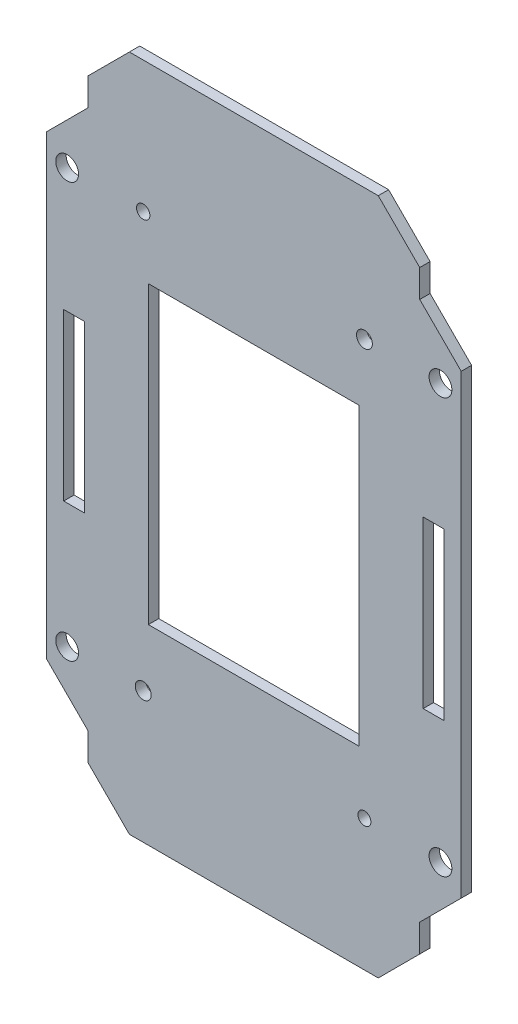
ISO-10303-21;
HEADER;
FILE_DESCRIPTION(('STEP AP214'),'2;1');
FILE_NAME('part.step','',(''),(''),'','','');
FILE_SCHEMA(('AUTOMOTIVE_DESIGN { 1 0 10303 214 1 1 1 1 }'));
ENDSEC;
DATA;
#1=APPLICATION_CONTEXT('core data for automotive mechanical design processes');
#2=APPLICATION_PROTOCOL_DEFINITION('international standard','automotive_design',2000,#1);
#3=PRODUCT_CONTEXT('',#1,'mechanical');
#4=PRODUCT('Part','Part','',(#3));
#5=PRODUCT_RELATED_PRODUCT_CATEGORY('part','',(#4));
#6=PRODUCT_DEFINITION_FORMATION('','',#4);
#7=PRODUCT_DEFINITION_CONTEXT('part definition',#1,'design');
#8=PRODUCT_DEFINITION('design','',#6,#7);
#9=PRODUCT_DEFINITION_SHAPE('','',#8);
#10=(LENGTH_UNIT() NAMED_UNIT(*) SI_UNIT(.MILLI.,.METRE.));
#11=(NAMED_UNIT(*) PLANE_ANGLE_UNIT() SI_UNIT($,.RADIAN.));
#12=(NAMED_UNIT(*) SI_UNIT($,.STERADIAN.) SOLID_ANGLE_UNIT());
#13=UNCERTAINTY_MEASURE_WITH_UNIT(LENGTH_MEASURE(1.E-05),#10,'distance_accuracy_value','');
#14=(GEOMETRIC_REPRESENTATION_CONTEXT(3) GLOBAL_UNCERTAINTY_ASSIGNED_CONTEXT((#13)) GLOBAL_UNIT_ASSIGNED_CONTEXT((#10,
#11,#12)) REPRESENTATION_CONTEXT('',''));
#15=CARTESIAN_POINT('',(0.,0.,0.));
#16=DIRECTION('',(0.,0.,1.));
#17=DIRECTION('',(1.,0.,0.));
#18=AXIS2_PLACEMENT_3D('',#15,#16,#17);
#19=CARTESIAN_POINT('',(0.,0.,1.5));
#20=DIRECTION('',(0.,0.,-1.));
#21=DIRECTION('',(-1.,0.,0.));
#22=AXIS2_PLACEMENT_3D('',#19,#20,#21);
#23=PLANE('',#22);
#24=DIRECTION('',(0.,-1.,0.));
#25=VECTOR('',#24,1.);
#26=CARTESIAN_POINT('',(-27.5,12.,1.5));
#27=LINE('',#26,#25);
#28=CARTESIAN_POINT('',(-27.5,12.,1.5));
#29=VERTEX_POINT('',#28);
#30=CARTESIAN_POINT('',(-27.5,-12.,1.5));
#31=VERTEX_POINT('',#30);
#32=EDGE_CURVE('E260',#29,#31,#27,.T.);
#33=ORIENTED_EDGE('',*,*,#32,.F.);
#34=DIRECTION('',(-1.,0.,0.));
#35=VECTOR('',#34,1.);
#36=CARTESIAN_POINT('',(-24.5,12.,1.5));
#37=LINE('',#36,#35);
#38=CARTESIAN_POINT('',(-24.5,12.,1.5));
#39=VERTEX_POINT('',#38);
#40=EDGE_CURVE('E268',#39,#29,#37,.T.);
#41=ORIENTED_EDGE('',*,*,#40,.F.);
#42=DIRECTION('',(0.,1.,0.));
#43=VECTOR('',#42,1.);
#44=CARTESIAN_POINT('',(-24.5,-12.,1.5));
#45=LINE('',#44,#43);
#46=CARTESIAN_POINT('',(-24.5,-12.,1.5));
#47=VERTEX_POINT('',#46);
#48=EDGE_CURVE('E265',#47,#39,#45,.T.);
#49=ORIENTED_EDGE('',*,*,#48,.F.);
#50=DIRECTION('',(1.,0.,0.));
#51=VECTOR('',#50,1.);
#52=CARTESIAN_POINT('',(-27.5,-12.,1.5));
#53=LINE('',#52,#51);
#54=EDGE_CURVE('E262',#31,#47,#53,.T.);
#55=ORIENTED_EDGE('',*,*,#54,.F.);
#56=EDGE_LOOP('',(#33,#41,#49,#55));
#57=FACE_BOUND('',#56,.T.);
#58=CARTESIAN_POINT('',(-16.,30.,1.5));
#59=DIRECTION('',(0.,0.,1.));
#60=DIRECTION('',(1.,0.,0.));
#61=AXIS2_PLACEMENT_3D('',#58,#59,#60);
#62=CIRCLE('',#61,0.967686677567539);
#63=CARTESIAN_POINT('',(-15.0323133224325,30.,1.5));
#64=VERTEX_POINT('',#63);
#65=EDGE_CURVE('E346',#64,#64,#62,.T.);
#66=ORIENTED_EDGE('',*,*,#65,.F.);
#67=EDGE_LOOP('',(#66));
#68=FACE_BOUND('',#67,.T.);
#69=CARTESIAN_POINT('',(16.,30.,1.5));
#70=DIRECTION('',(0.,0.,1.));
#71=DIRECTION('',(1.,0.,0.));
#72=AXIS2_PLACEMENT_3D('',#69,#70,#71);
#73=CIRCLE('',#72,1.15);
#74=CARTESIAN_POINT('',(17.15,30.,1.5));
#75=VERTEX_POINT('',#74);
#76=EDGE_CURVE('E352',#75,#75,#73,.T.);
#77=ORIENTED_EDGE('',*,*,#76,.F.);
#78=EDGE_LOOP('',(#77));
#79=FACE_BOUND('',#78,.T.);
#80=CARTESIAN_POINT('',(-16.,-30.,1.5));
#81=DIRECTION('',(0.,0.,1.));
#82=DIRECTION('',(1.,0.,0.));
#83=AXIS2_PLACEMENT_3D('',#80,#81,#82);
#84=CIRCLE('',#83,1.15);
#85=CARTESIAN_POINT('',(-14.85,-30.,1.5));
#86=VERTEX_POINT('',#85);
#87=EDGE_CURVE('E358',#86,#86,#84,.T.);
#88=ORIENTED_EDGE('',*,*,#87,.F.);
#89=EDGE_LOOP('',(#88));
#90=FACE_BOUND('',#89,.T.);
#91=CARTESIAN_POINT('',(16.,-30.,1.5));
#92=DIRECTION('',(0.,0.,1.));
#93=DIRECTION('',(1.,0.,0.));
#94=AXIS2_PLACEMENT_3D('',#91,#92,#93);
#95=CIRCLE('',#94,0.939967297360413);
#96=CARTESIAN_POINT('',(16.9399672973604,-30.,1.5));
#97=VERTEX_POINT('',#96);
#98=EDGE_CURVE('E364',#97,#97,#95,.T.);
#99=ORIENTED_EDGE('',*,*,#98,.F.);
#100=EDGE_LOOP('',(#99));
#101=FACE_BOUND('',#100,.T.);
#102=DIRECTION('',(0.707106781186548,0.707106781186548,0.));
#103=VECTOR('',#102,1.);
#104=CARTESIAN_POINT('',(30.,-33.,1.5));
#105=LINE('',#104,#103);
#106=CARTESIAN_POINT('',(24.,-39.,1.5));
#107=VERTEX_POINT('',#106);
#108=CARTESIAN_POINT('',(30.,-33.,1.5));
#109=VERTEX_POINT('',#108);
#110=EDGE_CURVE('E370',#107,#109,#105,.T.);
#111=ORIENTED_EDGE('',*,*,#110,.T.);
#112=DIRECTION('',(0.,1.,0.));
#113=VECTOR('',#112,1.);
#114=CARTESIAN_POINT('',(30.,33.,1.5));
#115=LINE('',#114,#113);
#116=CARTESIAN_POINT('',(30.,33.,1.5));
#117=VERTEX_POINT('',#116);
#118=EDGE_CURVE('E373',#109,#117,#115,.T.);
#119=ORIENTED_EDGE('',*,*,#118,.T.);
#120=DIRECTION('',(-0.707106781186548,0.707106781186548,0.));
#121=VECTOR('',#120,1.);
#122=CARTESIAN_POINT('',(24.,39.,1.5));
#123=LINE('',#122,#121);
#124=CARTESIAN_POINT('',(24.,39.,1.5));
#125=VERTEX_POINT('',#124);
#126=EDGE_CURVE('E376',#117,#125,#123,.T.);
#127=ORIENTED_EDGE('',*,*,#126,.T.);
#128=DIRECTION('',(0.,1.,0.));
#129=VECTOR('',#128,1.);
#130=CARTESIAN_POINT('',(24.,43.,1.5));
#131=LINE('',#130,#129);
#132=CARTESIAN_POINT('',(24.,43.,1.5));
#133=VERTEX_POINT('',#132);
#134=EDGE_CURVE('E378',#125,#133,#131,.T.);
#135=ORIENTED_EDGE('',*,*,#134,.T.);
#136=DIRECTION('',(-0.707106781186547,0.707106781186548,0.));
#137=VECTOR('',#136,1.);
#138=CARTESIAN_POINT('',(18.,49.,1.5));
#139=LINE('',#138,#137);
#140=CARTESIAN_POINT('',(18.,49.,1.5));
#141=VERTEX_POINT('',#140);
#142=EDGE_CURVE('E380',#133,#141,#139,.T.);
#143=ORIENTED_EDGE('',*,*,#142,.T.);
#144=DIRECTION('',(-1.,0.,0.));
#145=VECTOR('',#144,1.);
#146=CARTESIAN_POINT('',(-18.,49.,1.5));
#147=LINE('',#146,#145);
#148=CARTESIAN_POINT('',(-18.,49.,1.5));
#149=VERTEX_POINT('',#148);
#150=EDGE_CURVE('E382',#141,#149,#147,.T.);
#151=ORIENTED_EDGE('',*,*,#150,.T.);
#152=DIRECTION('',(-0.707106781186547,-0.707106781186548,0.));
#153=VECTOR('',#152,1.);
#154=CARTESIAN_POINT('',(-24.,43.,1.5));
#155=LINE('',#154,#153);
#156=CARTESIAN_POINT('',(-24.,43.,1.5));
#157=VERTEX_POINT('',#156);
#158=EDGE_CURVE('E384',#149,#157,#155,.T.);
#159=ORIENTED_EDGE('',*,*,#158,.T.);
#160=DIRECTION('',(0.,-1.,0.));
#161=VECTOR('',#160,1.);
#162=CARTESIAN_POINT('',(-24.,39.,1.5));
#163=LINE('',#162,#161);
#164=CARTESIAN_POINT('',(-24.,39.,1.5));
#165=VERTEX_POINT('',#164);
#166=EDGE_CURVE('E386',#157,#165,#163,.T.);
#167=ORIENTED_EDGE('',*,*,#166,.T.);
#168=DIRECTION('',(-0.707106781186548,-0.707106781186548,0.));
#169=VECTOR('',#168,1.);
#170=CARTESIAN_POINT('',(-30.,33.,1.5));
#171=LINE('',#170,#169);
#172=CARTESIAN_POINT('',(-30.,33.,1.5));
#173=VERTEX_POINT('',#172);
#174=EDGE_CURVE('E388',#165,#173,#171,.T.);
#175=ORIENTED_EDGE('',*,*,#174,.T.);
#176=DIRECTION('',(0.,-1.,0.));
#177=VECTOR('',#176,1.);
#178=CARTESIAN_POINT('',(-30.,-33.,1.5));
#179=LINE('',#178,#177);
#180=CARTESIAN_POINT('',(-30.,-33.,1.5));
#181=VERTEX_POINT('',#180);
#182=EDGE_CURVE('E390',#173,#181,#179,.T.);
#183=ORIENTED_EDGE('',*,*,#182,.T.);
#184=DIRECTION('',(0.707106781186548,-0.707106781186548,0.));
#185=VECTOR('',#184,1.);
#186=CARTESIAN_POINT('',(-24.,-39.,1.5));
#187=LINE('',#186,#185);
#188=CARTESIAN_POINT('',(-24.,-39.,1.5));
#189=VERTEX_POINT('',#188);
#190=EDGE_CURVE('E392',#181,#189,#187,.T.);
#191=ORIENTED_EDGE('',*,*,#190,.T.);
#192=DIRECTION('',(0.,-1.,0.));
#193=VECTOR('',#192,1.);
#194=CARTESIAN_POINT('',(-24.,-43.,1.5));
#195=LINE('',#194,#193);
#196=CARTESIAN_POINT('',(-24.,-43.,1.5));
#197=VERTEX_POINT('',#196);
#198=EDGE_CURVE('E394',#189,#197,#195,.T.);
#199=ORIENTED_EDGE('',*,*,#198,.T.);
#200=DIRECTION('',(0.707106781186547,-0.707106781186548,0.));
#201=VECTOR('',#200,1.);
#202=CARTESIAN_POINT('',(-18.,-49.,1.5));
#203=LINE('',#202,#201);
#204=CARTESIAN_POINT('',(-18.,-49.,1.5));
#205=VERTEX_POINT('',#204);
#206=EDGE_CURVE('E396',#197,#205,#203,.T.);
#207=ORIENTED_EDGE('',*,*,#206,.T.);
#208=DIRECTION('',(1.,0.,0.));
#209=VECTOR('',#208,1.);
#210=CARTESIAN_POINT('',(18.,-49.,1.5));
#211=LINE('',#210,#209);
#212=CARTESIAN_POINT('',(18.,-49.,1.5));
#213=VERTEX_POINT('',#212);
#214=EDGE_CURVE('E398',#205,#213,#211,.T.);
#215=ORIENTED_EDGE('',*,*,#214,.T.);
#216=DIRECTION('',(0.707106781186547,0.707106781186548,0.));
#217=VECTOR('',#216,1.);
#218=CARTESIAN_POINT('',(24.,-43.,1.5));
#219=LINE('',#218,#217);
#220=CARTESIAN_POINT('',(24.,-43.,1.5));
#221=VERTEX_POINT('',#220);
#222=EDGE_CURVE('E400',#213,#221,#219,.T.);
#223=ORIENTED_EDGE('',*,*,#222,.T.);
#224=DIRECTION('',(0.,1.,0.));
#225=VECTOR('',#224,1.);
#226=CARTESIAN_POINT('',(24.,-39.,1.5));
#227=LINE('',#226,#225);
#228=EDGE_CURVE('E402',#221,#107,#227,.T.);
#229=ORIENTED_EDGE('',*,*,#228,.T.);
#230=EDGE_LOOP('',(#111,#119,#127,#135,#143,#151,#159,#167,#175,#183,#191,#199,#207,#215,#223,#229));
#231=FACE_BOUND('',#230,.T.);
#232=DIRECTION('',(0.,1.,0.));
#233=VECTOR('',#232,1.);
#234=CARTESIAN_POINT('',(15.2491,21.3549,1.5));
#235=LINE('',#234,#233);
#236=CARTESIAN_POINT('',(15.2491,-21.3549,1.5));
#237=VERTEX_POINT('',#236);
#238=CARTESIAN_POINT('',(15.2491,21.3549,1.5));
#239=VERTEX_POINT('',#238);
#240=EDGE_CURVE('E315',#237,#239,#235,.T.);
#241=ORIENTED_EDGE('',*,*,#240,.F.);
#242=DIRECTION('',(1.,0.,0.));
#243=VECTOR('',#242,1.);
#244=CARTESIAN_POINT('',(-15.2491,-21.3549,1.5));
#245=LINE('',#244,#243);
#246=CARTESIAN_POINT('',(-15.2491,-21.3549,1.5));
#247=VERTEX_POINT('',#246);
#248=EDGE_CURVE('E323',#247,#237,#245,.T.);
#249=ORIENTED_EDGE('',*,*,#248,.F.);
#250=DIRECTION('',(0.,-1.,0.));
#251=VECTOR('',#250,1.);
#252=CARTESIAN_POINT('',(-15.2491,21.3549,1.5));
#253=LINE('',#252,#251);
#254=CARTESIAN_POINT('',(-15.2491,21.3549,1.5));
#255=VERTEX_POINT('',#254);
#256=EDGE_CURVE('E320',#255,#247,#253,.T.);
#257=ORIENTED_EDGE('',*,*,#256,.F.);
#258=DIRECTION('',(-1.,0.,0.));
#259=VECTOR('',#258,1.);
#260=CARTESIAN_POINT('',(-15.2491,21.3549,1.5));
#261=LINE('',#260,#259);
#262=EDGE_CURVE('E317',#239,#255,#261,.T.);
#263=ORIENTED_EDGE('',*,*,#262,.F.);
#264=EDGE_LOOP('',(#241,#249,#257,#263));
#265=FACE_BOUND('',#264,.T.);
#266=CARTESIAN_POINT('',(-27.,-30.,1.5));
#267=DIRECTION('',(0.,0.,1.));
#268=DIRECTION('',(1.,0.,0.));
#269=AXIS2_PLACEMENT_3D('',#266,#267,#268);
#270=CIRCLE('',#269,1.65);
#271=CARTESIAN_POINT('',(-25.35,-30.,1.5));
#272=VERTEX_POINT('',#271);
#273=EDGE_CURVE('E309',#272,#272,#270,.T.);
#274=ORIENTED_EDGE('',*,*,#273,.F.);
#275=EDGE_LOOP('',(#274));
#276=FACE_BOUND('',#275,.T.);
#277=CARTESIAN_POINT('',(-27.,30.,1.5));
#278=DIRECTION('',(0.,0.,1.));
#279=DIRECTION('',(1.,0.,0.));
#280=AXIS2_PLACEMENT_3D('',#277,#278,#279);
#281=CIRCLE('',#280,1.65);
#282=CARTESIAN_POINT('',(-25.35,30.,1.5));
#283=VERTEX_POINT('',#282);
#284=EDGE_CURVE('E303',#283,#283,#281,.T.);
#285=ORIENTED_EDGE('',*,*,#284,.F.);
#286=EDGE_LOOP('',(#285));
#287=FACE_BOUND('',#286,.T.);
#288=CARTESIAN_POINT('',(27.,-30.,1.5));
#289=DIRECTION('',(0.,0.,1.));
#290=DIRECTION('',(1.,0.,0.));
#291=AXIS2_PLACEMENT_3D('',#288,#289,#290);
#292=CIRCLE('',#291,1.65);
#293=CARTESIAN_POINT('',(28.65,-30.,1.5));
#294=VERTEX_POINT('',#293);
#295=EDGE_CURVE('E297',#294,#294,#292,.T.);
#296=ORIENTED_EDGE('',*,*,#295,.F.);
#297=EDGE_LOOP('',(#296));
#298=FACE_BOUND('',#297,.T.);
#299=CARTESIAN_POINT('',(27.,30.,1.5));
#300=DIRECTION('',(0.,0.,1.));
#301=DIRECTION('',(1.,0.,0.));
#302=AXIS2_PLACEMENT_3D('',#299,#300,#301);
#303=CIRCLE('',#302,1.65);
#304=CARTESIAN_POINT('',(28.65,30.,1.5));
#305=VERTEX_POINT('',#304);
#306=EDGE_CURVE('E291',#305,#305,#303,.T.);
#307=ORIENTED_EDGE('',*,*,#306,.F.);
#308=EDGE_LOOP('',(#307));
#309=FACE_BOUND('',#308,.T.);
#310=DIRECTION('',(0.,-1.,0.));
#311=VECTOR('',#310,1.);
#312=CARTESIAN_POINT('',(24.5,12.,1.5));
#313=LINE('',#312,#311);
#314=CARTESIAN_POINT('',(24.5,12.,1.5));
#315=VERTEX_POINT('',#314);
#316=CARTESIAN_POINT('',(24.5,-12.,1.5));
#317=VERTEX_POINT('',#316);
#318=EDGE_CURVE('E224',#315,#317,#313,.T.);
#319=ORIENTED_EDGE('',*,*,#318,.F.);
#320=DIRECTION('',(-1.,0.,0.));
#321=VECTOR('',#320,1.);
#322=CARTESIAN_POINT('',(27.5,12.,1.5));
#323=LINE('',#322,#321);
#324=CARTESIAN_POINT('',(27.5,12.,1.5));
#325=VERTEX_POINT('',#324);
#326=EDGE_CURVE('E246',#325,#315,#323,.T.);
#327=ORIENTED_EDGE('',*,*,#326,.F.);
#328=DIRECTION('',(0.,1.,0.));
#329=VECTOR('',#328,1.);
#330=CARTESIAN_POINT('',(27.5,-12.,1.5));
#331=LINE('',#330,#329);
#332=CARTESIAN_POINT('',(27.5,-12.,1.5));
#333=VERTEX_POINT('',#332);
#334=EDGE_CURVE('E244',#333,#325,#331,.T.);
#335=ORIENTED_EDGE('',*,*,#334,.F.);
#336=DIRECTION('',(1.,0.,0.));
#337=VECTOR('',#336,1.);
#338=CARTESIAN_POINT('',(24.5,-12.,1.5));
#339=LINE('',#338,#337);
#340=EDGE_CURVE('E232',#317,#333,#339,.T.);
#341=ORIENTED_EDGE('',*,*,#340,.F.);
#342=EDGE_LOOP('',(#319,#327,#335,#341));
#343=FACE_BOUND('',#342,.T.);
#344=ADVANCED_FACE('F39',(#57,#68,#79,#90,#101,#231,#265,#276,#287,#298,#309,#343),#23,.F.);
#345=CARTESIAN_POINT('',(0.,0.,0.));
#346=DIRECTION('',(0.,0.,-1.));
#347=DIRECTION('',(-1.,0.,0.));
#348=AXIS2_PLACEMENT_3D('',#345,#346,#347);
#349=PLANE('',#348);
#350=CARTESIAN_POINT('',(27.,-30.,0.));
#351=DIRECTION('',(0.,0.,1.));
#352=DIRECTION('',(1.,0.,0.));
#353=AXIS2_PLACEMENT_3D('',#350,#351,#352);
#354=CIRCLE('',#353,1.65);
#355=CARTESIAN_POINT('',(28.65,-30.,0.));
#356=VERTEX_POINT('',#355);
#357=EDGE_CURVE('E294',#356,#356,#354,.T.);
#358=ORIENTED_EDGE('',*,*,#357,.T.);
#359=EDGE_LOOP('',(#358));
#360=FACE_BOUND('',#359,.T.);
#361=CARTESIAN_POINT('',(-27.,-30.,0.));
#362=DIRECTION('',(0.,0.,1.));
#363=DIRECTION('',(1.,0.,0.));
#364=AXIS2_PLACEMENT_3D('',#361,#362,#363);
#365=CIRCLE('',#364,1.65);
#366=CARTESIAN_POINT('',(-25.35,-30.,0.));
#367=VERTEX_POINT('',#366);
#368=EDGE_CURVE('E306',#367,#367,#365,.T.);
#369=ORIENTED_EDGE('',*,*,#368,.T.);
#370=EDGE_LOOP('',(#369));
#371=FACE_BOUND('',#370,.T.);
#372=CARTESIAN_POINT('',(16.,30.,0.));
#373=DIRECTION('',(0.,0.,1.));
#374=DIRECTION('',(1.,0.,0.));
#375=AXIS2_PLACEMENT_3D('',#372,#373,#374);
#376=CIRCLE('',#375,1.15);
#377=CARTESIAN_POINT('',(17.15,30.,0.));
#378=VERTEX_POINT('',#377);
#379=EDGE_CURVE('E349',#378,#378,#376,.T.);
#380=ORIENTED_EDGE('',*,*,#379,.T.);
#381=EDGE_LOOP('',(#380));
#382=FACE_BOUND('',#381,.T.);
#383=CARTESIAN_POINT('',(16.,-30.,0.));
#384=DIRECTION('',(0.,0.,1.));
#385=DIRECTION('',(1.,0.,0.));
#386=AXIS2_PLACEMENT_3D('',#383,#384,#385);
#387=CIRCLE('',#386,0.939967297360413);
#388=CARTESIAN_POINT('',(16.9399672973604,-30.,0.));
#389=VERTEX_POINT('',#388);
#390=EDGE_CURVE('E361',#389,#389,#387,.T.);
#391=ORIENTED_EDGE('',*,*,#390,.T.);
#392=EDGE_LOOP('',(#391));
#393=FACE_BOUND('',#392,.T.);
#394=DIRECTION('',(0.707106781186548,0.707106781186548,0.));
#395=VECTOR('',#394,1.);
#396=CARTESIAN_POINT('',(30.,-33.,0.));
#397=LINE('',#396,#395);
#398=CARTESIAN_POINT('',(24.,-39.,0.));
#399=VERTEX_POINT('',#398);
#400=CARTESIAN_POINT('',(30.,-33.,0.));
#401=VERTEX_POINT('',#400);
#402=EDGE_CURVE('E367',#399,#401,#397,.T.);
#403=ORIENTED_EDGE('',*,*,#402,.F.);
#404=DIRECTION('',(0.,1.,0.));
#405=VECTOR('',#404,1.);
#406=CARTESIAN_POINT('',(24.,-39.,0.));
#407=LINE('',#406,#405);
#408=CARTESIAN_POINT('',(24.,-43.,0.));
#409=VERTEX_POINT('',#408);
#410=EDGE_CURVE('E374',#409,#399,#407,.T.);
#411=ORIENTED_EDGE('',*,*,#410,.F.);
#412=DIRECTION('',(0.707106781186547,0.707106781186548,0.));
#413=VECTOR('',#412,1.);
#414=CARTESIAN_POINT('',(24.,-43.,0.));
#415=LINE('',#414,#413);
#416=CARTESIAN_POINT('',(18.,-49.,0.));
#417=VERTEX_POINT('',#416);
#418=EDGE_CURVE('E433',#417,#409,#415,.T.);
#419=ORIENTED_EDGE('',*,*,#418,.F.);
#420=DIRECTION('',(1.,0.,0.));
#421=VECTOR('',#420,1.);
#422=CARTESIAN_POINT('',(18.,-49.,0.));
#423=LINE('',#422,#421);
#424=CARTESIAN_POINT('',(-18.,-49.,0.));
#425=VERTEX_POINT('',#424);
#426=EDGE_CURVE('E431',#425,#417,#423,.T.);
#427=ORIENTED_EDGE('',*,*,#426,.F.);
#428=DIRECTION('',(0.707106781186547,-0.707106781186548,0.));
#429=VECTOR('',#428,1.);
#430=CARTESIAN_POINT('',(-18.,-49.,0.));
#431=LINE('',#430,#429);
#432=CARTESIAN_POINT('',(-24.,-43.,0.));
#433=VERTEX_POINT('',#432);
#434=EDGE_CURVE('E429',#433,#425,#431,.T.);
#435=ORIENTED_EDGE('',*,*,#434,.F.);
#436=DIRECTION('',(0.,-1.,0.));
#437=VECTOR('',#436,1.);
#438=CARTESIAN_POINT('',(-24.,-43.,0.));
#439=LINE('',#438,#437);
#440=CARTESIAN_POINT('',(-24.,-39.,0.));
#441=VERTEX_POINT('',#440);
#442=EDGE_CURVE('E427',#441,#433,#439,.T.);
#443=ORIENTED_EDGE('',*,*,#442,.F.);
#444=DIRECTION('',(0.707106781186548,-0.707106781186548,0.));
#445=VECTOR('',#444,1.);
#446=CARTESIAN_POINT('',(-24.,-39.,0.));
#447=LINE('',#446,#445);
#448=CARTESIAN_POINT('',(-30.,-33.,0.));
#449=VERTEX_POINT('',#448);
#450=EDGE_CURVE('E425',#449,#441,#447,.T.);
#451=ORIENTED_EDGE('',*,*,#450,.F.);
#452=DIRECTION('',(0.,-1.,0.));
#453=VECTOR('',#452,1.);
#454=CARTESIAN_POINT('',(-30.,-33.,0.));
#455=LINE('',#454,#453);
#456=CARTESIAN_POINT('',(-30.,33.,0.));
#457=VERTEX_POINT('',#456);
#458=EDGE_CURVE('E423',#457,#449,#455,.T.);
#459=ORIENTED_EDGE('',*,*,#458,.F.);
#460=DIRECTION('',(-0.707106781186548,-0.707106781186548,0.));
#461=VECTOR('',#460,1.);
#462=CARTESIAN_POINT('',(-30.,33.,0.));
#463=LINE('',#462,#461);
#464=CARTESIAN_POINT('',(-24.,39.,0.));
#465=VERTEX_POINT('',#464);
#466=EDGE_CURVE('E421',#465,#457,#463,.T.);
#467=ORIENTED_EDGE('',*,*,#466,.F.);
#468=DIRECTION('',(0.,-1.,0.));
#469=VECTOR('',#468,1.);
#470=CARTESIAN_POINT('',(-24.,39.,0.));
#471=LINE('',#470,#469);
#472=CARTESIAN_POINT('',(-24.,43.,0.));
#473=VERTEX_POINT('',#472);
#474=EDGE_CURVE('E419',#473,#465,#471,.T.);
#475=ORIENTED_EDGE('',*,*,#474,.F.);
#476=DIRECTION('',(-0.707106781186547,-0.707106781186548,0.));
#477=VECTOR('',#476,1.);
#478=CARTESIAN_POINT('',(-24.,43.,0.));
#479=LINE('',#478,#477);
#480=CARTESIAN_POINT('',(-18.,49.,0.));
#481=VERTEX_POINT('',#480);
#482=EDGE_CURVE('E417',#481,#473,#479,.T.);
#483=ORIENTED_EDGE('',*,*,#482,.F.);
#484=DIRECTION('',(-1.,0.,0.));
#485=VECTOR('',#484,1.);
#486=CARTESIAN_POINT('',(-18.,49.,0.));
#487=LINE('',#486,#485);
#488=CARTESIAN_POINT('',(18.,49.,0.));
#489=VERTEX_POINT('',#488);
#490=EDGE_CURVE('E415',#489,#481,#487,.T.);
#491=ORIENTED_EDGE('',*,*,#490,.F.);
#492=DIRECTION('',(-0.707106781186547,0.707106781186548,0.));
#493=VECTOR('',#492,1.);
#494=CARTESIAN_POINT('',(18.,49.,0.));
#495=LINE('',#494,#493);
#496=CARTESIAN_POINT('',(24.,43.,0.));
#497=VERTEX_POINT('',#496);
#498=EDGE_CURVE('E413',#497,#489,#495,.T.);
#499=ORIENTED_EDGE('',*,*,#498,.F.);
#500=DIRECTION('',(0.,1.,0.));
#501=VECTOR('',#500,1.);
#502=CARTESIAN_POINT('',(24.,43.,0.));
#503=LINE('',#502,#501);
#504=CARTESIAN_POINT('',(24.,39.,0.));
#505=VERTEX_POINT('',#504);
#506=EDGE_CURVE('E411',#505,#497,#503,.T.);
#507=ORIENTED_EDGE('',*,*,#506,.F.);
#508=DIRECTION('',(-0.707106781186548,0.707106781186548,0.));
#509=VECTOR('',#508,1.);
#510=CARTESIAN_POINT('',(24.,39.,0.));
#511=LINE('',#510,#509);
#512=CARTESIAN_POINT('',(30.,33.,0.));
#513=VERTEX_POINT('',#512);
#514=EDGE_CURVE('E409',#513,#505,#511,.T.);
#515=ORIENTED_EDGE('',*,*,#514,.F.);
#516=DIRECTION('',(0.,1.,0.));
#517=VECTOR('',#516,1.);
#518=CARTESIAN_POINT('',(30.,33.,0.));
#519=LINE('',#518,#517);
#520=EDGE_CURVE('E407',#401,#513,#519,.T.);
#521=ORIENTED_EDGE('',*,*,#520,.F.);
#522=EDGE_LOOP('',(#403,#411,#419,#427,#435,#443,#451,#459,#467,#475,#483,#491,#499,#507,#515,#521));
#523=FACE_BOUND('',#522,.T.);
#524=CARTESIAN_POINT('',(-16.,-30.,0.));
#525=DIRECTION('',(0.,0.,1.));
#526=DIRECTION('',(1.,0.,0.));
#527=AXIS2_PLACEMENT_3D('',#524,#525,#526);
#528=CIRCLE('',#527,1.15);
#529=CARTESIAN_POINT('',(-14.85,-30.,0.));
#530=VERTEX_POINT('',#529);
#531=EDGE_CURVE('E355',#530,#530,#528,.T.);
#532=ORIENTED_EDGE('',*,*,#531,.T.);
#533=EDGE_LOOP('',(#532));
#534=FACE_BOUND('',#533,.T.);
#535=CARTESIAN_POINT('',(-16.,30.,0.));
#536=DIRECTION('',(0.,0.,1.));
#537=DIRECTION('',(1.,0.,0.));
#538=AXIS2_PLACEMENT_3D('',#535,#536,#537);
#539=CIRCLE('',#538,0.967686677567539);
#540=CARTESIAN_POINT('',(-15.0323133224325,30.,0.));
#541=VERTEX_POINT('',#540);
#542=EDGE_CURVE('E345',#541,#541,#539,.T.);
#543=ORIENTED_EDGE('',*,*,#542,.T.);
#544=EDGE_LOOP('',(#543));
#545=FACE_BOUND('',#544,.T.);
#546=DIRECTION('',(1.,0.,0.));
#547=VECTOR('',#546,1.);
#548=CARTESIAN_POINT('',(-15.2491,-21.3549,0.));
#549=LINE('',#548,#547);
#550=CARTESIAN_POINT('',(-15.2491,-21.3549,0.));
#551=VERTEX_POINT('',#550);
#552=CARTESIAN_POINT('',(15.2491,-21.3549,0.));
#553=VERTEX_POINT('',#552);
#554=EDGE_CURVE('E318',#551,#553,#549,.T.);
#555=ORIENTED_EDGE('',*,*,#554,.T.);
#556=DIRECTION('',(0.,1.,0.));
#557=VECTOR('',#556,1.);
#558=CARTESIAN_POINT('',(15.2491,21.3549,0.));
#559=LINE('',#558,#557);
#560=CARTESIAN_POINT('',(15.2491,21.3549,0.));
#561=VERTEX_POINT('',#560);
#562=EDGE_CURVE('E312',#553,#561,#559,.T.);
#563=ORIENTED_EDGE('',*,*,#562,.T.);
#564=DIRECTION('',(-1.,0.,0.));
#565=VECTOR('',#564,1.);
#566=CARTESIAN_POINT('',(-15.2491,21.3549,0.));
#567=LINE('',#566,#565);
#568=CARTESIAN_POINT('',(-15.2491,21.3549,0.));
#569=VERTEX_POINT('',#568);
#570=EDGE_CURVE('E328',#561,#569,#567,.T.);
#571=ORIENTED_EDGE('',*,*,#570,.T.);
#572=DIRECTION('',(0.,-1.,0.));
#573=VECTOR('',#572,1.);
#574=CARTESIAN_POINT('',(-15.2491,21.3549,0.));
#575=LINE('',#574,#573);
#576=EDGE_CURVE('E331',#569,#551,#575,.T.);
#577=ORIENTED_EDGE('',*,*,#576,.T.);
#578=EDGE_LOOP('',(#555,#563,#571,#577));
#579=FACE_BOUND('',#578,.T.);
#580=CARTESIAN_POINT('',(-27.,30.,0.));
#581=DIRECTION('',(0.,0.,1.));
#582=DIRECTION('',(1.,0.,0.));
#583=AXIS2_PLACEMENT_3D('',#580,#581,#582);
#584=CIRCLE('',#583,1.65);
#585=CARTESIAN_POINT('',(-25.35,30.,0.));
#586=VERTEX_POINT('',#585);
#587=EDGE_CURVE('E300',#586,#586,#584,.T.);
#588=ORIENTED_EDGE('',*,*,#587,.T.);
#589=EDGE_LOOP('',(#588));
#590=FACE_BOUND('',#589,.T.);
#591=CARTESIAN_POINT('',(27.,30.,0.));
#592=DIRECTION('',(0.,0.,1.));
#593=DIRECTION('',(1.,0.,0.));
#594=AXIS2_PLACEMENT_3D('',#591,#592,#593);
#595=CIRCLE('',#594,1.65);
#596=CARTESIAN_POINT('',(28.65,30.,0.));
#597=VERTEX_POINT('',#596);
#598=EDGE_CURVE('E290',#597,#597,#595,.T.);
#599=ORIENTED_EDGE('',*,*,#598,.T.);
#600=EDGE_LOOP('',(#599));
#601=FACE_BOUND('',#600,.T.);
#602=DIRECTION('',(-1.,0.,0.));
#603=VECTOR('',#602,1.);
#604=CARTESIAN_POINT('',(-24.5,12.,0.));
#605=LINE('',#604,#603);
#606=CARTESIAN_POINT('',(-24.5,12.,0.));
#607=VERTEX_POINT('',#606);
#608=CARTESIAN_POINT('',(-27.5,12.,0.));
#609=VERTEX_POINT('',#608);
#610=EDGE_CURVE('E263',#607,#609,#605,.T.);
#611=ORIENTED_EDGE('',*,*,#610,.T.);
#612=DIRECTION('',(0.,-1.,0.));
#613=VECTOR('',#612,1.);
#614=CARTESIAN_POINT('',(-27.5,12.,0.));
#615=LINE('',#614,#613);
#616=CARTESIAN_POINT('',(-27.5,-12.,0.));
#617=VERTEX_POINT('',#616);
#618=EDGE_CURVE('E240',#609,#617,#615,.T.);
#619=ORIENTED_EDGE('',*,*,#618,.T.);
#620=DIRECTION('',(1.,0.,0.));
#621=VECTOR('',#620,1.);
#622=CARTESIAN_POINT('',(-27.5,-12.,0.));
#623=LINE('',#622,#621);
#624=CARTESIAN_POINT('',(-24.5,-12.,0.));
#625=VERTEX_POINT('',#624);
#626=EDGE_CURVE('E273',#617,#625,#623,.T.);
#627=ORIENTED_EDGE('',*,*,#626,.T.);
#628=DIRECTION('',(0.,1.,0.));
#629=VECTOR('',#628,1.);
#630=CARTESIAN_POINT('',(-24.5,-12.,0.));
#631=LINE('',#630,#629);
#632=EDGE_CURVE('E276',#625,#607,#631,.T.);
#633=ORIENTED_EDGE('',*,*,#632,.T.);
#634=EDGE_LOOP('',(#611,#619,#627,#633));
#635=FACE_BOUND('',#634,.T.);
#636=DIRECTION('',(-1.,0.,0.));
#637=VECTOR('',#636,1.);
#638=CARTESIAN_POINT('',(27.5,12.,0.));
#639=LINE('',#638,#637);
#640=CARTESIAN_POINT('',(27.5,12.,0.));
#641=VERTEX_POINT('',#640);
#642=CARTESIAN_POINT('',(24.5,12.,0.));
#643=VERTEX_POINT('',#642);
#644=EDGE_CURVE('E233',#641,#643,#639,.T.);
#645=ORIENTED_EDGE('',*,*,#644,.T.);
#646=DIRECTION('',(0.,-1.,0.));
#647=VECTOR('',#646,1.);
#648=CARTESIAN_POINT('',(24.5,12.,0.));
#649=LINE('',#648,#647);
#650=CARTESIAN_POINT('',(24.5,-12.,0.));
#651=VERTEX_POINT('',#650);
#652=EDGE_CURVE('E62',#643,#651,#649,.T.);
#653=ORIENTED_EDGE('',*,*,#652,.T.);
#654=DIRECTION('',(1.,0.,0.));
#655=VECTOR('',#654,1.);
#656=CARTESIAN_POINT('',(24.5,-12.,0.));
#657=LINE('',#656,#655);
#658=CARTESIAN_POINT('',(27.5,-12.,0.));
#659=VERTEX_POINT('',#658);
#660=EDGE_CURVE('E239',#651,#659,#657,.T.);
#661=ORIENTED_EDGE('',*,*,#660,.T.);
#662=DIRECTION('',(0.,1.,0.));
#663=VECTOR('',#662,1.);
#664=CARTESIAN_POINT('',(27.5,-12.,0.));
#665=LINE('',#664,#663);
#666=EDGE_CURVE('E252',#659,#641,#665,.T.);
#667=ORIENTED_EDGE('',*,*,#666,.T.);
#668=EDGE_LOOP('',(#645,#653,#661,#667));
#669=FACE_BOUND('',#668,.T.);
#670=ADVANCED_FACE('F487',(#360,#371,#382,#393,#523,#534,#545,#579,#590,#601,#635,#669),#349,.T.);
#671=CARTESIAN_POINT('',(30.,-33.,1.5));
#672=DIRECTION('',(-0.707106781186547,0.707106781186547,0.));
#673=DIRECTION('',(-0.707106781186548,-0.707106781186548,0.));
#674=AXIS2_PLACEMENT_3D('',#671,#672,#673);
#675=PLANE('',#674);
#676=ORIENTED_EDGE('',*,*,#402,.T.);
#677=DIRECTION('',(0.,0.,-1.));
#678=VECTOR('',#677,1.);
#679=CARTESIAN_POINT('',(30.,-33.,1.5));
#680=LINE('',#679,#678);
#681=EDGE_CURVE('E11',#109,#401,#680,.T.);
#682=ORIENTED_EDGE('',*,*,#681,.F.);
#683=ORIENTED_EDGE('',*,*,#110,.F.);
#684=DIRECTION('',(0.,0.,-1.));
#685=VECTOR('',#684,1.);
#686=CARTESIAN_POINT('',(24.,-39.,1.5));
#687=LINE('',#686,#685);
#688=EDGE_CURVE('E404',#107,#399,#687,.T.);
#689=ORIENTED_EDGE('',*,*,#688,.T.);
#690=EDGE_LOOP('',(#676,#682,#683,#689));
#691=FACE_BOUND('',#690,.T.);
#692=ADVANCED_FACE('F41',(#691),#675,.F.);
#693=CARTESIAN_POINT('',(30.,33.,1.5));
#694=DIRECTION('',(-1.,0.,0.));
#695=DIRECTION('',(0.,0.,1.));
#696=AXIS2_PLACEMENT_3D('',#693,#694,#695);
#697=PLANE('',#696);
#698=ORIENTED_EDGE('',*,*,#520,.T.);
#699=DIRECTION('',(0.,0.,-1.));
#700=VECTOR('',#699,1.);
#701=CARTESIAN_POINT('',(30.,33.,1.5));
#702=LINE('',#701,#700);
#703=EDGE_CURVE('E47',#117,#513,#702,.T.);
#704=ORIENTED_EDGE('',*,*,#703,.F.);
#705=ORIENTED_EDGE('',*,*,#118,.F.);
#706=ORIENTED_EDGE('',*,*,#681,.T.);
#707=EDGE_LOOP('',(#698,#704,#705,#706));
#708=FACE_BOUND('',#707,.T.);
#709=ADVANCED_FACE('F505',(#708),#697,.F.);
#710=CARTESIAN_POINT('',(24.,39.,1.5));
#711=DIRECTION('',(-0.707106781186547,-0.707106781186547,0.));
#712=DIRECTION('',(0.707106781186548,-0.707106781186548,0.));
#713=AXIS2_PLACEMENT_3D('',#710,#711,#712);
#714=PLANE('',#713);
#715=ORIENTED_EDGE('',*,*,#514,.T.);
#716=DIRECTION('',(0.,0.,-1.));
#717=VECTOR('',#716,1.);
#718=CARTESIAN_POINT('',(24.,39.,1.5));
#719=LINE('',#718,#717);
#720=EDGE_CURVE('E474',#125,#505,#719,.T.);
#721=ORIENTED_EDGE('',*,*,#720,.F.);
#722=ORIENTED_EDGE('',*,*,#126,.F.);
#723=ORIENTED_EDGE('',*,*,#703,.T.);
#724=EDGE_LOOP('',(#715,#721,#722,#723));
#725=FACE_BOUND('',#724,.T.);
#726=ADVANCED_FACE('F481',(#725),#714,.F.);
#727=CARTESIAN_POINT('',(24.,43.,1.5));
#728=DIRECTION('',(-1.,0.,0.));
#729=DIRECTION('',(0.,0.,1.));
#730=AXIS2_PLACEMENT_3D('',#727,#728,#729);
#731=PLANE('',#730);
#732=ORIENTED_EDGE('',*,*,#506,.T.);
#733=DIRECTION('',(0.,0.,-1.));
#734=VECTOR('',#733,1.);
#735=CARTESIAN_POINT('',(24.,43.,1.5));
#736=LINE('',#735,#734);
#737=EDGE_CURVE('E471',#133,#497,#736,.T.);
#738=ORIENTED_EDGE('',*,*,#737,.F.);
#739=ORIENTED_EDGE('',*,*,#134,.F.);
#740=ORIENTED_EDGE('',*,*,#720,.T.);
#741=EDGE_LOOP('',(#732,#738,#739,#740));
#742=FACE_BOUND('',#741,.T.);
#743=ADVANCED_FACE('F493',(#742),#731,.F.);
#744=CARTESIAN_POINT('',(18.,49.,1.5));
#745=DIRECTION('',(-0.707106781186548,-0.707106781186547,0.));
#746=DIRECTION('',(0.707106781186547,-0.707106781186548,0.));
#747=AXIS2_PLACEMENT_3D('',#744,#745,#746);
#748=PLANE('',#747);
#749=ORIENTED_EDGE('',*,*,#498,.T.);
#750=DIRECTION('',(0.,0.,-1.));
#751=VECTOR('',#750,1.);
#752=CARTESIAN_POINT('',(18.,49.,1.5));
#753=LINE('',#752,#751);
#754=EDGE_CURVE('E468',#141,#489,#753,.T.);
#755=ORIENTED_EDGE('',*,*,#754,.F.);
#756=ORIENTED_EDGE('',*,*,#142,.F.);
#757=ORIENTED_EDGE('',*,*,#737,.T.);
#758=EDGE_LOOP('',(#749,#755,#756,#757));
#759=FACE_BOUND('',#758,.T.);
#760=ADVANCED_FACE('F497',(#759),#748,.F.);
#761=CARTESIAN_POINT('',(-18.,49.,1.5));
#762=DIRECTION('',(0.,-1.,0.));
#763=DIRECTION('',(0.,0.,-1.));
#764=AXIS2_PLACEMENT_3D('',#761,#762,#763);
#765=PLANE('',#764);
#766=ORIENTED_EDGE('',*,*,#490,.T.);
#767=DIRECTION('',(0.,0.,-1.));
#768=VECTOR('',#767,1.);
#769=CARTESIAN_POINT('',(-18.,49.,1.5));
#770=LINE('',#769,#768);
#771=EDGE_CURVE('E465',#149,#481,#770,.T.);
#772=ORIENTED_EDGE('',*,*,#771,.F.);
#773=ORIENTED_EDGE('',*,*,#150,.F.);
#774=ORIENTED_EDGE('',*,*,#754,.T.);
#775=EDGE_LOOP('',(#766,#772,#773,#774));
#776=FACE_BOUND('',#775,.T.);
#777=ADVANCED_FACE('F558',(#776),#765,.F.);
#778=CARTESIAN_POINT('',(-24.,43.,1.5));
#779=DIRECTION('',(0.707106781186548,-0.707106781186547,0.));
#780=DIRECTION('',(0.707106781186547,0.707106781186548,0.));
#781=AXIS2_PLACEMENT_3D('',#778,#779,#780);
#782=PLANE('',#781);
#783=ORIENTED_EDGE('',*,*,#482,.T.);
#784=DIRECTION('',(0.,0.,-1.));
#785=VECTOR('',#784,1.);
#786=CARTESIAN_POINT('',(-24.,43.,1.5));
#787=LINE('',#786,#785);
#788=EDGE_CURVE('E462',#157,#473,#787,.T.);
#789=ORIENTED_EDGE('',*,*,#788,.F.);
#790=ORIENTED_EDGE('',*,*,#158,.F.);
#791=ORIENTED_EDGE('',*,*,#771,.T.);
#792=EDGE_LOOP('',(#783,#789,#790,#791));
#793=FACE_BOUND('',#792,.T.);
#794=ADVANCED_FACE('F555',(#793),#782,.F.);
#795=CARTESIAN_POINT('',(-24.,39.,1.5));
#796=DIRECTION('',(1.,0.,0.));
#797=DIRECTION('',(0.,0.,-1.));
#798=AXIS2_PLACEMENT_3D('',#795,#796,#797);
#799=PLANE('',#798);
#800=ORIENTED_EDGE('',*,*,#474,.T.);
#801=DIRECTION('',(0.,0.,-1.));
#802=VECTOR('',#801,1.);
#803=CARTESIAN_POINT('',(-24.,39.,1.5));
#804=LINE('',#803,#802);
#805=EDGE_CURVE('E459',#165,#465,#804,.T.);
#806=ORIENTED_EDGE('',*,*,#805,.F.);
#807=ORIENTED_EDGE('',*,*,#166,.F.);
#808=ORIENTED_EDGE('',*,*,#788,.T.);
#809=EDGE_LOOP('',(#800,#806,#807,#808));
#810=FACE_BOUND('',#809,.T.);
#811=ADVANCED_FACE('F551',(#810),#799,.F.);
#812=CARTESIAN_POINT('',(-30.,33.,1.5));
#813=DIRECTION('',(0.707106781186547,-0.707106781186547,0.));
#814=DIRECTION('',(0.707106781186548,0.707106781186548,0.));
#815=AXIS2_PLACEMENT_3D('',#812,#813,#814);
#816=PLANE('',#815);
#817=ORIENTED_EDGE('',*,*,#466,.T.);
#818=DIRECTION('',(0.,0.,-1.));
#819=VECTOR('',#818,1.);
#820=CARTESIAN_POINT('',(-30.,33.,1.5));
#821=LINE('',#820,#819);
#822=EDGE_CURVE('E456',#173,#457,#821,.T.);
#823=ORIENTED_EDGE('',*,*,#822,.F.);
#824=ORIENTED_EDGE('',*,*,#174,.F.);
#825=ORIENTED_EDGE('',*,*,#805,.T.);
#826=EDGE_LOOP('',(#817,#823,#824,#825));
#827=FACE_BOUND('',#826,.T.);
#828=ADVANCED_FACE('F547',(#827),#816,.F.);
#829=CARTESIAN_POINT('',(-30.,-33.,1.5));
#830=DIRECTION('',(1.,0.,0.));
#831=DIRECTION('',(0.,0.,-1.));
#832=AXIS2_PLACEMENT_3D('',#829,#830,#831);
#833=PLANE('',#832);
#834=ORIENTED_EDGE('',*,*,#458,.T.);
#835=DIRECTION('',(0.,0.,-1.));
#836=VECTOR('',#835,1.);
#837=CARTESIAN_POINT('',(-30.,-33.,1.5));
#838=LINE('',#837,#836);
#839=EDGE_CURVE('E453',#181,#449,#838,.T.);
#840=ORIENTED_EDGE('',*,*,#839,.F.);
#841=ORIENTED_EDGE('',*,*,#182,.F.);
#842=ORIENTED_EDGE('',*,*,#822,.T.);
#843=EDGE_LOOP('',(#834,#840,#841,#842));
#844=FACE_BOUND('',#843,.T.);
#845=ADVANCED_FACE('F542',(#844),#833,.F.);
#846=CARTESIAN_POINT('',(-24.,-39.,1.5));
#847=DIRECTION('',(0.707106781186547,0.707106781186547,0.));
#848=DIRECTION('',(-0.707106781186548,0.707106781186548,0.));
#849=AXIS2_PLACEMENT_3D('',#846,#847,#848);
#850=PLANE('',#849);
#851=ORIENTED_EDGE('',*,*,#450,.T.);
#852=DIRECTION('',(0.,0.,-1.));
#853=VECTOR('',#852,1.);
#854=CARTESIAN_POINT('',(-24.,-39.,1.5));
#855=LINE('',#854,#853);
#856=EDGE_CURVE('E450',#189,#441,#855,.T.);
#857=ORIENTED_EDGE('',*,*,#856,.F.);
#858=ORIENTED_EDGE('',*,*,#190,.F.);
#859=ORIENTED_EDGE('',*,*,#839,.T.);
#860=EDGE_LOOP('',(#851,#857,#858,#859));
#861=FACE_BOUND('',#860,.T.);
#862=ADVANCED_FACE('F536',(#861),#850,.F.);
#863=CARTESIAN_POINT('',(-24.,-43.,1.5));
#864=DIRECTION('',(1.,0.,0.));
#865=DIRECTION('',(0.,0.,-1.));
#866=AXIS2_PLACEMENT_3D('',#863,#864,#865);
#867=PLANE('',#866);
#868=ORIENTED_EDGE('',*,*,#442,.T.);
#869=DIRECTION('',(0.,0.,-1.));
#870=VECTOR('',#869,1.);
#871=CARTESIAN_POINT('',(-24.,-43.,1.5));
#872=LINE('',#871,#870);
#873=EDGE_CURVE('E447',#197,#433,#872,.T.);
#874=ORIENTED_EDGE('',*,*,#873,.F.);
#875=ORIENTED_EDGE('',*,*,#198,.F.);
#876=ORIENTED_EDGE('',*,*,#856,.T.);
#877=EDGE_LOOP('',(#868,#874,#875,#876));
#878=FACE_BOUND('',#877,.T.);
#879=ADVANCED_FACE('F532',(#878),#867,.F.);
#880=CARTESIAN_POINT('',(-18.,-49.,1.5));
#881=DIRECTION('',(0.707106781186548,0.707106781186547,0.));
#882=DIRECTION('',(-0.707106781186547,0.707106781186548,0.));
#883=AXIS2_PLACEMENT_3D('',#880,#881,#882);
#884=PLANE('',#883);
#885=ORIENTED_EDGE('',*,*,#434,.T.);
#886=DIRECTION('',(0.,0.,-1.));
#887=VECTOR('',#886,1.);
#888=CARTESIAN_POINT('',(-18.,-49.,1.5));
#889=LINE('',#888,#887);
#890=EDGE_CURVE('E444',#205,#425,#889,.T.);
#891=ORIENTED_EDGE('',*,*,#890,.F.);
#892=ORIENTED_EDGE('',*,*,#206,.F.);
#893=ORIENTED_EDGE('',*,*,#873,.T.);
#894=EDGE_LOOP('',(#885,#891,#892,#893));
#895=FACE_BOUND('',#894,.T.);
#896=ADVANCED_FACE('F527',(#895),#884,.F.);
#897=CARTESIAN_POINT('',(18.,-49.,1.5));
#898=DIRECTION('',(0.,1.,0.));
#899=DIRECTION('',(0.,0.,1.));
#900=AXIS2_PLACEMENT_3D('',#897,#898,#899);
#901=PLANE('',#900);
#902=ORIENTED_EDGE('',*,*,#426,.T.);
#903=DIRECTION('',(0.,0.,-1.));
#904=VECTOR('',#903,1.);
#905=CARTESIAN_POINT('',(18.,-49.,1.5));
#906=LINE('',#905,#904);
#907=EDGE_CURVE('E441',#213,#417,#906,.T.);
#908=ORIENTED_EDGE('',*,*,#907,.F.);
#909=ORIENTED_EDGE('',*,*,#214,.F.);
#910=ORIENTED_EDGE('',*,*,#890,.T.);
#911=EDGE_LOOP('',(#902,#908,#909,#910));
#912=FACE_BOUND('',#911,.T.);
#913=ADVANCED_FACE('F521',(#912),#901,.F.);
#914=CARTESIAN_POINT('',(24.,-43.,1.5));
#915=DIRECTION('',(-0.707106781186548,0.707106781186547,0.));
#916=DIRECTION('',(-0.707106781186547,-0.707106781186548,0.));
#917=AXIS2_PLACEMENT_3D('',#914,#915,#916);
#918=PLANE('',#917);
#919=ORIENTED_EDGE('',*,*,#418,.T.);
#920=DIRECTION('',(0.,0.,-1.));
#921=VECTOR('',#920,1.);
#922=CARTESIAN_POINT('',(24.,-43.,1.5));
#923=LINE('',#922,#921);
#924=EDGE_CURVE('E438',#221,#409,#923,.T.);
#925=ORIENTED_EDGE('',*,*,#924,.F.);
#926=ORIENTED_EDGE('',*,*,#222,.F.);
#927=ORIENTED_EDGE('',*,*,#907,.T.);
#928=EDGE_LOOP('',(#919,#925,#926,#927));
#929=FACE_BOUND('',#928,.T.);
#930=ADVANCED_FACE('F517',(#929),#918,.F.);
#931=CARTESIAN_POINT('',(24.,-39.,1.5));
#932=DIRECTION('',(-1.,0.,0.));
#933=DIRECTION('',(0.,0.,1.));
#934=AXIS2_PLACEMENT_3D('',#931,#932,#933);
#935=PLANE('',#934);
#936=ORIENTED_EDGE('',*,*,#410,.T.);
#937=ORIENTED_EDGE('',*,*,#688,.F.);
#938=ORIENTED_EDGE('',*,*,#228,.F.);
#939=ORIENTED_EDGE('',*,*,#924,.T.);
#940=EDGE_LOOP('',(#936,#937,#938,#939));
#941=FACE_BOUND('',#940,.T.);
#942=ADVANCED_FACE('F512',(#941),#935,.F.);
#943=CARTESIAN_POINT('',(16.,-30.,1.5));
#944=DIRECTION('',(0.,0.,-1.));
#945=DIRECTION('',(-1.,0.,0.));
#946=AXIS2_PLACEMENT_3D('',#943,#944,#945);
#947=CYLINDRICAL_SURFACE('',#946,0.939967297360413);
#948=ORIENTED_EDGE('',*,*,#98,.T.);
#949=EDGE_LOOP('',(#948));
#950=FACE_BOUND('',#949,.T.);
#951=ORIENTED_EDGE('',*,*,#390,.F.);
#952=EDGE_LOOP('',(#951));
#953=FACE_BOUND('',#952,.T.);
#954=ADVANCED_FACE('F578',(#950,#953),#947,.F.);
#955=CARTESIAN_POINT('',(-16.,-30.,1.5));
#956=DIRECTION('',(0.,0.,-1.));
#957=DIRECTION('',(-1.,0.,0.));
#958=AXIS2_PLACEMENT_3D('',#955,#956,#957);
#959=CYLINDRICAL_SURFACE('',#958,1.15);
#960=ORIENTED_EDGE('',*,*,#87,.T.);
#961=EDGE_LOOP('',(#960));
#962=FACE_BOUND('',#961,.T.);
#963=ORIENTED_EDGE('',*,*,#531,.F.);
#964=EDGE_LOOP('',(#963));
#965=FACE_BOUND('',#964,.T.);
#966=ADVANCED_FACE('F640',(#962,#965),#959,.F.);
#967=CARTESIAN_POINT('',(16.,30.,1.5));
#968=DIRECTION('',(0.,0.,-1.));
#969=DIRECTION('',(-1.,0.,0.));
#970=AXIS2_PLACEMENT_3D('',#967,#968,#969);
#971=CYLINDRICAL_SURFACE('',#970,1.15);
#972=ORIENTED_EDGE('',*,*,#76,.T.);
#973=EDGE_LOOP('',(#972));
#974=FACE_BOUND('',#973,.T.);
#975=ORIENTED_EDGE('',*,*,#379,.F.);
#976=EDGE_LOOP('',(#975));
#977=FACE_BOUND('',#976,.T.);
#978=ADVANCED_FACE('F647',(#974,#977),#971,.F.);
#979=CARTESIAN_POINT('',(-16.,30.,1.5));
#980=DIRECTION('',(0.,0.,-1.));
#981=DIRECTION('',(-1.,0.,0.));
#982=AXIS2_PLACEMENT_3D('',#979,#980,#981);
#983=CYLINDRICAL_SURFACE('',#982,0.967686677567539);
#984=ORIENTED_EDGE('',*,*,#65,.T.);
#985=EDGE_LOOP('',(#984));
#986=FACE_BOUND('',#985,.T.);
#987=ORIENTED_EDGE('',*,*,#542,.F.);
#988=EDGE_LOOP('',(#987));
#989=FACE_BOUND('',#988,.T.);
#990=ADVANCED_FACE('F654',(#986,#989),#983,.F.);
#991=CARTESIAN_POINT('',(15.2491,21.3549,1.5));
#992=DIRECTION('',(-1.,0.,0.));
#993=DIRECTION('',(0.,0.,1.));
#994=AXIS2_PLACEMENT_3D('',#991,#992,#993);
#995=PLANE('',#994);
#996=ORIENTED_EDGE('',*,*,#562,.F.);
#997=DIRECTION('',(0.,0.,-1.));
#998=VECTOR('',#997,1.);
#999=CARTESIAN_POINT('',(15.2491,-21.3549,1.5));
#1000=LINE('',#999,#998);
#1001=EDGE_CURVE('E325',#237,#553,#1000,.T.);
#1002=ORIENTED_EDGE('',*,*,#1001,.F.);
#1003=ORIENTED_EDGE('',*,*,#240,.T.);
#1004=DIRECTION('',(0.,0.,-1.));
#1005=VECTOR('',#1004,1.);
#1006=CARTESIAN_POINT('',(15.2491,21.3549,1.5));
#1007=LINE('',#1006,#1005);
#1008=EDGE_CURVE('E342',#239,#561,#1007,.T.);
#1009=ORIENTED_EDGE('',*,*,#1008,.T.);
#1010=EDGE_LOOP('',(#996,#1002,#1003,#1009));
#1011=FACE_BOUND('',#1010,.T.);
#1012=ADVANCED_FACE('F662',(#1011),#995,.T.);
#1013=CARTESIAN_POINT('',(-15.2491,21.3549,1.5));
#1014=DIRECTION('',(0.,-1.,0.));
#1015=DIRECTION('',(0.,0.,-1.));
#1016=AXIS2_PLACEMENT_3D('',#1013,#1014,#1015);
#1017=PLANE('',#1016);
#1018=ORIENTED_EDGE('',*,*,#570,.F.);
#1019=ORIENTED_EDGE('',*,*,#1008,.F.);
#1020=ORIENTED_EDGE('',*,*,#262,.T.);
#1021=DIRECTION('',(0.,0.,-1.));
#1022=VECTOR('',#1021,1.);
#1023=CARTESIAN_POINT('',(-15.2491,21.3549,1.5));
#1024=LINE('',#1023,#1022);
#1025=EDGE_CURVE('E340',#255,#569,#1024,.T.);
#1026=ORIENTED_EDGE('',*,*,#1025,.T.);
#1027=EDGE_LOOP('',(#1018,#1019,#1020,#1026));
#1028=FACE_BOUND('',#1027,.T.);
#1029=ADVANCED_FACE('F670',(#1028),#1017,.T.);
#1030=CARTESIAN_POINT('',(-15.2491,21.3549,1.5));
#1031=DIRECTION('',(1.,0.,0.));
#1032=DIRECTION('',(0.,0.,-1.));
#1033=AXIS2_PLACEMENT_3D('',#1030,#1031,#1032);
#1034=PLANE('',#1033);
#1035=ORIENTED_EDGE('',*,*,#576,.F.);
#1036=ORIENTED_EDGE('',*,*,#1025,.F.);
#1037=ORIENTED_EDGE('',*,*,#256,.T.);
#1038=DIRECTION('',(0.,0.,-1.));
#1039=VECTOR('',#1038,1.);
#1040=CARTESIAN_POINT('',(-15.2491,-21.3549,1.5));
#1041=LINE('',#1040,#1039);
#1042=EDGE_CURVE('E338',#247,#551,#1041,.T.);
#1043=ORIENTED_EDGE('',*,*,#1042,.T.);
#1044=EDGE_LOOP('',(#1035,#1036,#1037,#1043));
#1045=FACE_BOUND('',#1044,.T.);
#1046=ADVANCED_FACE('F678',(#1045),#1034,.T.);
#1047=CARTESIAN_POINT('',(-15.2491,-21.3549,1.5));
#1048=DIRECTION('',(0.,1.,0.));
#1049=DIRECTION('',(0.,0.,1.));
#1050=AXIS2_PLACEMENT_3D('',#1047,#1048,#1049);
#1051=PLANE('',#1050);
#1052=ORIENTED_EDGE('',*,*,#554,.F.);
#1053=ORIENTED_EDGE('',*,*,#1042,.F.);
#1054=ORIENTED_EDGE('',*,*,#248,.T.);
#1055=ORIENTED_EDGE('',*,*,#1001,.T.);
#1056=EDGE_LOOP('',(#1052,#1053,#1054,#1055));
#1057=FACE_BOUND('',#1056,.T.);
#1058=ADVANCED_FACE('F686',(#1057),#1051,.T.);
#1059=CARTESIAN_POINT('',(-27.,-30.,1.5));
#1060=DIRECTION('',(0.,0.,-1.));
#1061=DIRECTION('',(-1.,0.,0.));
#1062=AXIS2_PLACEMENT_3D('',#1059,#1060,#1061);
#1063=CYLINDRICAL_SURFACE('',#1062,1.65);
#1064=ORIENTED_EDGE('',*,*,#273,.T.);
#1065=EDGE_LOOP('',(#1064));
#1066=FACE_BOUND('',#1065,.T.);
#1067=ORIENTED_EDGE('',*,*,#368,.F.);
#1068=EDGE_LOOP('',(#1067));
#1069=FACE_BOUND('',#1068,.T.);
#1070=ADVANCED_FACE('F694',(#1066,#1069),#1063,.F.);
#1071=CARTESIAN_POINT('',(-27.,30.,1.5));
#1072=DIRECTION('',(0.,0.,-1.));
#1073=DIRECTION('',(-1.,0.,0.));
#1074=AXIS2_PLACEMENT_3D('',#1071,#1072,#1073);
#1075=CYLINDRICAL_SURFACE('',#1074,1.65);
#1076=ORIENTED_EDGE('',*,*,#284,.T.);
#1077=EDGE_LOOP('',(#1076));
#1078=FACE_BOUND('',#1077,.T.);
#1079=ORIENTED_EDGE('',*,*,#587,.F.);
#1080=EDGE_LOOP('',(#1079));
#1081=FACE_BOUND('',#1080,.T.);
#1082=ADVANCED_FACE('F702',(#1078,#1081),#1075,.F.);
#1083=CARTESIAN_POINT('',(27.,-30.,1.5));
#1084=DIRECTION('',(0.,0.,-1.));
#1085=DIRECTION('',(-1.,0.,0.));
#1086=AXIS2_PLACEMENT_3D('',#1083,#1084,#1085);
#1087=CYLINDRICAL_SURFACE('',#1086,1.65);
#1088=ORIENTED_EDGE('',*,*,#295,.T.);
#1089=EDGE_LOOP('',(#1088));
#1090=FACE_BOUND('',#1089,.T.);
#1091=ORIENTED_EDGE('',*,*,#357,.F.);
#1092=EDGE_LOOP('',(#1091));
#1093=FACE_BOUND('',#1092,.T.);
#1094=ADVANCED_FACE('F710',(#1090,#1093),#1087,.F.);
#1095=CARTESIAN_POINT('',(27.,30.,1.5));
#1096=DIRECTION('',(0.,0.,-1.));
#1097=DIRECTION('',(-1.,0.,0.));
#1098=AXIS2_PLACEMENT_3D('',#1095,#1096,#1097);
#1099=CYLINDRICAL_SURFACE('',#1098,1.65);
#1100=ORIENTED_EDGE('',*,*,#306,.T.);
#1101=EDGE_LOOP('',(#1100));
#1102=FACE_BOUND('',#1101,.T.);
#1103=ORIENTED_EDGE('',*,*,#598,.F.);
#1104=EDGE_LOOP('',(#1103));
#1105=FACE_BOUND('',#1104,.T.);
#1106=ADVANCED_FACE('F718',(#1102,#1105),#1099,.F.);
#1107=CARTESIAN_POINT('',(-27.5,12.,1.5));
#1108=DIRECTION('',(1.,0.,0.));
#1109=DIRECTION('',(0.,0.,-1.));
#1110=AXIS2_PLACEMENT_3D('',#1107,#1108,#1109);
#1111=PLANE('',#1110);
#1112=ORIENTED_EDGE('',*,*,#618,.F.);
#1113=DIRECTION('',(0.,0.,-1.));
#1114=VECTOR('',#1113,1.);
#1115=CARTESIAN_POINT('',(-27.5,12.,1.5));
#1116=LINE('',#1115,#1114);
#1117=EDGE_CURVE('E270',#29,#609,#1116,.T.);
#1118=ORIENTED_EDGE('',*,*,#1117,.F.);
#1119=ORIENTED_EDGE('',*,*,#32,.T.);
#1120=DIRECTION('',(0.,0.,-1.));
#1121=VECTOR('',#1120,1.);
#1122=CARTESIAN_POINT('',(-27.5,-12.,1.5));
#1123=LINE('',#1122,#1121);
#1124=EDGE_CURVE('E287',#31,#617,#1123,.T.);
#1125=ORIENTED_EDGE('',*,*,#1124,.T.);
#1126=EDGE_LOOP('',(#1112,#1118,#1119,#1125));
#1127=FACE_BOUND('',#1126,.T.);
#1128=ADVANCED_FACE('F726',(#1127),#1111,.T.);
#1129=CARTESIAN_POINT('',(-27.5,-12.,1.5));
#1130=DIRECTION('',(0.,1.,0.));
#1131=DIRECTION('',(0.,0.,1.));
#1132=AXIS2_PLACEMENT_3D('',#1129,#1130,#1131);
#1133=PLANE('',#1132);
#1134=ORIENTED_EDGE('',*,*,#626,.F.);
#1135=ORIENTED_EDGE('',*,*,#1124,.F.);
#1136=ORIENTED_EDGE('',*,*,#54,.T.);
#1137=DIRECTION('',(0.,0.,-1.));
#1138=VECTOR('',#1137,1.);
#1139=CARTESIAN_POINT('',(-24.5,-12.,1.5));
#1140=LINE('',#1139,#1138);
#1141=EDGE_CURVE('E285',#47,#625,#1140,.T.);
#1142=ORIENTED_EDGE('',*,*,#1141,.T.);
#1143=EDGE_LOOP('',(#1134,#1135,#1136,#1142));
#1144=FACE_BOUND('',#1143,.T.);
#1145=ADVANCED_FACE('F734',(#1144),#1133,.T.);
#1146=CARTESIAN_POINT('',(-24.5,-12.,1.5));
#1147=DIRECTION('',(-1.,0.,0.));
#1148=DIRECTION('',(0.,0.,1.));
#1149=AXIS2_PLACEMENT_3D('',#1146,#1147,#1148);
#1150=PLANE('',#1149);
#1151=ORIENTED_EDGE('',*,*,#632,.F.);
#1152=ORIENTED_EDGE('',*,*,#1141,.F.);
#1153=ORIENTED_EDGE('',*,*,#48,.T.);
#1154=DIRECTION('',(0.,0.,-1.));
#1155=VECTOR('',#1154,1.);
#1156=CARTESIAN_POINT('',(-24.5,12.,1.5));
#1157=LINE('',#1156,#1155);
#1158=EDGE_CURVE('E283',#39,#607,#1157,.T.);
#1159=ORIENTED_EDGE('',*,*,#1158,.T.);
#1160=EDGE_LOOP('',(#1151,#1152,#1153,#1159));
#1161=FACE_BOUND('',#1160,.T.);
#1162=ADVANCED_FACE('F742',(#1161),#1150,.T.);
#1163=CARTESIAN_POINT('',(-24.5,12.,1.5));
#1164=DIRECTION('',(0.,-1.,0.));
#1165=DIRECTION('',(0.,0.,-1.));
#1166=AXIS2_PLACEMENT_3D('',#1163,#1164,#1165);
#1167=PLANE('',#1166);
#1168=ORIENTED_EDGE('',*,*,#610,.F.);
#1169=ORIENTED_EDGE('',*,*,#1158,.F.);
#1170=ORIENTED_EDGE('',*,*,#40,.T.);
#1171=ORIENTED_EDGE('',*,*,#1117,.T.);
#1172=EDGE_LOOP('',(#1168,#1169,#1170,#1171));
#1173=FACE_BOUND('',#1172,.T.);
#1174=ADVANCED_FACE('F750',(#1173),#1167,.T.);
#1175=CARTESIAN_POINT('',(24.5,12.,1.5));
#1176=DIRECTION('',(1.,0.,0.));
#1177=DIRECTION('',(0.,0.,-1.));
#1178=AXIS2_PLACEMENT_3D('',#1175,#1176,#1177);
#1179=PLANE('',#1178);
#1180=ORIENTED_EDGE('',*,*,#652,.F.);
#1181=DIRECTION('',(0.,0.,-1.));
#1182=VECTOR('',#1181,1.);
#1183=CARTESIAN_POINT('',(24.5,12.,1.5));
#1184=LINE('',#1183,#1182);
#1185=EDGE_CURVE('E228',#315,#643,#1184,.T.);
#1186=ORIENTED_EDGE('',*,*,#1185,.F.);
#1187=ORIENTED_EDGE('',*,*,#318,.T.);
#1188=DIRECTION('',(0.,0.,-1.));
#1189=VECTOR('',#1188,1.);
#1190=CARTESIAN_POINT('',(24.5,-12.,1.5));
#1191=LINE('',#1190,#1189);
#1192=EDGE_CURVE('E227',#317,#651,#1191,.T.);
#1193=ORIENTED_EDGE('',*,*,#1192,.T.);
#1194=EDGE_LOOP('',(#1180,#1186,#1187,#1193));
#1195=FACE_BOUND('',#1194,.T.);
#1196=ADVANCED_FACE('F226',(#1195),#1179,.T.);
#1197=CARTESIAN_POINT('',(24.5,-12.,1.5));
#1198=DIRECTION('',(0.,1.,0.));
#1199=DIRECTION('',(0.,0.,1.));
#1200=AXIS2_PLACEMENT_3D('',#1197,#1198,#1199);
#1201=PLANE('',#1200);
#1202=ORIENTED_EDGE('',*,*,#660,.F.);
#1203=ORIENTED_EDGE('',*,*,#1192,.F.);
#1204=ORIENTED_EDGE('',*,*,#340,.T.);
#1205=DIRECTION('',(0.,0.,-1.));
#1206=VECTOR('',#1205,1.);
#1207=CARTESIAN_POINT('',(27.5,-12.,1.5));
#1208=LINE('',#1207,#1206);
#1209=EDGE_CURVE('E241',#333,#659,#1208,.T.);
#1210=ORIENTED_EDGE('',*,*,#1209,.T.);
#1211=EDGE_LOOP('',(#1202,#1203,#1204,#1210));
#1212=FACE_BOUND('',#1211,.T.);
#1213=ADVANCED_FACE('F236',(#1212),#1201,.T.);
#1214=CARTESIAN_POINT('',(27.5,-12.,1.5));
#1215=DIRECTION('',(-1.,0.,0.));
#1216=DIRECTION('',(0.,0.,1.));
#1217=AXIS2_PLACEMENT_3D('',#1214,#1215,#1216);
#1218=PLANE('',#1217);
#1219=ORIENTED_EDGE('',*,*,#666,.F.);
#1220=ORIENTED_EDGE('',*,*,#1209,.F.);
#1221=ORIENTED_EDGE('',*,*,#334,.T.);
#1222=DIRECTION('',(0.,0.,-1.));
#1223=VECTOR('',#1222,1.);
#1224=CARTESIAN_POINT('',(27.5,12.,1.5));
#1225=LINE('',#1224,#1223);
#1226=EDGE_CURVE('E54',#325,#641,#1225,.T.);
#1227=ORIENTED_EDGE('',*,*,#1226,.T.);
#1228=EDGE_LOOP('',(#1219,#1220,#1221,#1227));
#1229=FACE_BOUND('',#1228,.T.);
#1230=ADVANCED_FACE('F771',(#1229),#1218,.T.);
#1231=CARTESIAN_POINT('',(27.5,12.,1.5));
#1232=DIRECTION('',(0.,-1.,0.));
#1233=DIRECTION('',(0.,0.,-1.));
#1234=AXIS2_PLACEMENT_3D('',#1231,#1232,#1233);
#1235=PLANE('',#1234);
#1236=ORIENTED_EDGE('',*,*,#644,.F.);
#1237=ORIENTED_EDGE('',*,*,#1226,.F.);
#1238=ORIENTED_EDGE('',*,*,#326,.T.);
#1239=ORIENTED_EDGE('',*,*,#1185,.T.);
#1240=EDGE_LOOP('',(#1236,#1237,#1238,#1239));
#1241=FACE_BOUND('',#1240,.T.);
#1242=ADVANCED_FACE('F778',(#1241),#1235,.T.);
#1243=CLOSED_SHELL('',(#344,#670,#692,#709,#726,#743,#760,#777,#794,#811,#828,#845,#862,#879,
#896,#913,#930,#942,#954,#966,#978,#990,#1012,#1029,#1046,#1058,#1070,#1082,#1094,#1106,#1128,
#1145,#1162,#1174,#1196,#1213,#1230,#1242));
#1244=MANIFOLD_SOLID_BREP('B2',#1243);
#1245=ADVANCED_BREP_SHAPE_REPRESENTATION('',(#18,#1244),#14);
#1246=SHAPE_DEFINITION_REPRESENTATION(#9,#1245);
ENDSEC;
END-ISO-10303-21;
